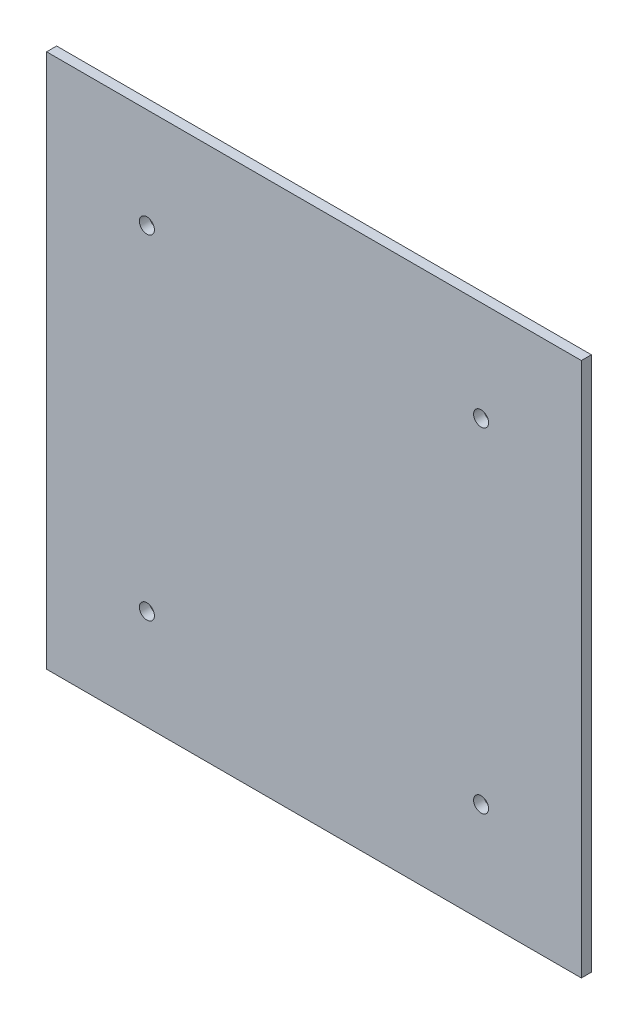
ISO-10303-21;
HEADER;
FILE_DESCRIPTION(('STEP AP214'),'2;1');
FILE_NAME('part.step','',(''),(''),'','','');
FILE_SCHEMA(('AUTOMOTIVE_DESIGN { 1 0 10303 214 1 1 1 1 }'));
ENDSEC;
DATA;
#1=APPLICATION_CONTEXT('core data for automotive mechanical design processes');
#2=APPLICATION_PROTOCOL_DEFINITION('international standard','automotive_design',2000,#1);
#3=PRODUCT_CONTEXT('',#1,'mechanical');
#4=PRODUCT('Part','Part','',(#3));
#5=PRODUCT_RELATED_PRODUCT_CATEGORY('part','',(#4));
#6=PRODUCT_DEFINITION_FORMATION('','',#4);
#7=PRODUCT_DEFINITION_CONTEXT('part definition',#1,'design');
#8=PRODUCT_DEFINITION('design','',#6,#7);
#9=PRODUCT_DEFINITION_SHAPE('','',#8);
#10=(LENGTH_UNIT() NAMED_UNIT(*) SI_UNIT(.MILLI.,.METRE.));
#11=(NAMED_UNIT(*) PLANE_ANGLE_UNIT() SI_UNIT($,.RADIAN.));
#12=(NAMED_UNIT(*) SI_UNIT($,.STERADIAN.) SOLID_ANGLE_UNIT());
#13=UNCERTAINTY_MEASURE_WITH_UNIT(LENGTH_MEASURE(1.E-05),#10,'distance_accuracy_value','');
#14=(GEOMETRIC_REPRESENTATION_CONTEXT(3) GLOBAL_UNCERTAINTY_ASSIGNED_CONTEXT((#13)) GLOBAL_UNIT_ASSIGNED_CONTEXT((#10,
#11,#12)) REPRESENTATION_CONTEXT('',''));
#15=CARTESIAN_POINT('',(0.,0.,0.));
#16=DIRECTION('',(0.,0.,1.));
#17=DIRECTION('',(1.,0.,0.));
#18=AXIS2_PLACEMENT_3D('',#15,#16,#17);
#19=CARTESIAN_POINT('',(0.,0.,3.));
#20=DIRECTION('',(0.,0.,1.));
#21=DIRECTION('',(1.,0.,0.));
#22=AXIS2_PLACEMENT_3D('',#19,#20,#21);
#23=PLANE('',#22);
#24=CARTESIAN_POINT('',(50.,50.,3.));
#25=DIRECTION('',(0.,0.,1.));
#26=DIRECTION('',(1.,0.,0.));
#27=AXIS2_PLACEMENT_3D('',#24,#25,#26);
#28=CIRCLE('',#27,2.25);
#29=CARTESIAN_POINT('',(52.25,50.,3.));
#30=VERTEX_POINT('',#29);
#31=EDGE_CURVE('E120',#30,#30,#28,.T.);
#32=ORIENTED_EDGE('',*,*,#31,.F.);
#33=EDGE_LOOP('',(#32));
#34=FACE_BOUND('',#33,.T.);
#35=CARTESIAN_POINT('',(50.,-50.,3.));
#36=DIRECTION('',(0.,0.,1.));
#37=DIRECTION('',(1.,0.,0.));
#38=AXIS2_PLACEMENT_3D('',#35,#36,#37);
#39=CIRCLE('',#38,2.25);
#40=CARTESIAN_POINT('',(52.25,-50.,3.));
#41=VERTEX_POINT('',#40);
#42=EDGE_CURVE('E116',#41,#41,#39,.T.);
#43=ORIENTED_EDGE('',*,*,#42,.F.);
#44=EDGE_LOOP('',(#43));
#45=FACE_BOUND('',#44,.T.);
#46=CARTESIAN_POINT('',(-50.,50.,3.));
#47=DIRECTION('',(0.,0.,1.));
#48=DIRECTION('',(1.,0.,0.));
#49=AXIS2_PLACEMENT_3D('',#46,#47,#48);
#50=CIRCLE('',#49,2.25);
#51=CARTESIAN_POINT('',(-47.75,50.,3.));
#52=VERTEX_POINT('',#51);
#53=EDGE_CURVE('E112',#52,#52,#50,.T.);
#54=ORIENTED_EDGE('',*,*,#53,.F.);
#55=EDGE_LOOP('',(#54));
#56=FACE_BOUND('',#55,.T.);
#57=CARTESIAN_POINT('',(-50.,-50.,3.));
#58=DIRECTION('',(0.,0.,1.));
#59=DIRECTION('',(1.,0.,0.));
#60=AXIS2_PLACEMENT_3D('',#57,#58,#59);
#61=CIRCLE('',#60,2.25);
#62=CARTESIAN_POINT('',(-47.75,-50.,3.));
#63=VERTEX_POINT('',#62);
#64=EDGE_CURVE('E77',#63,#63,#61,.T.);
#65=ORIENTED_EDGE('',*,*,#64,.F.);
#66=EDGE_LOOP('',(#65));
#67=FACE_BOUND('',#66,.T.);
#68=DIRECTION('',(-1.,0.,0.));
#69=VECTOR('',#68,1.);
#70=CARTESIAN_POINT('',(0.,-80.,3.));
#71=LINE('',#70,#69);
#72=CARTESIAN_POINT('',(80.,-80.,3.));
#73=VERTEX_POINT('',#72);
#74=CARTESIAN_POINT('',(-80.,-80.,3.));
#75=VERTEX_POINT('',#74);
#76=EDGE_CURVE('E11',#73,#75,#71,.T.);
#77=ORIENTED_EDGE('',*,*,#76,.F.);
#78=DIRECTION('',(0.,-1.,0.));
#79=VECTOR('',#78,1.);
#80=CARTESIAN_POINT('',(80.,0.,3.));
#81=LINE('',#80,#79);
#82=CARTESIAN_POINT('',(80.,80.,3.));
#83=VERTEX_POINT('',#82);
#84=EDGE_CURVE('E64',#83,#73,#81,.T.);
#85=ORIENTED_EDGE('',*,*,#84,.F.);
#86=DIRECTION('',(1.,0.,0.));
#87=VECTOR('',#86,1.);
#88=CARTESIAN_POINT('',(0.,80.,3.));
#89=LINE('',#88,#87);
#90=CARTESIAN_POINT('',(-80.,80.,3.));
#91=VERTEX_POINT('',#90);
#92=EDGE_CURVE('E103',#91,#83,#89,.T.);
#93=ORIENTED_EDGE('',*,*,#92,.F.);
#94=DIRECTION('',(0.,1.,0.));
#95=VECTOR('',#94,1.);
#96=CARTESIAN_POINT('',(-80.,0.,3.));
#97=LINE('',#96,#95);
#98=EDGE_CURVE('E26',#75,#91,#97,.T.);
#99=ORIENTED_EDGE('',*,*,#98,.F.);
#100=EDGE_LOOP('',(#77,#85,#93,#99));
#101=FACE_BOUND('',#100,.T.);
#102=ADVANCED_FACE('F17',(#34,#45,#56,#67,#101),#23,.T.);
#103=CARTESIAN_POINT('',(0.,-80.,0.));
#104=DIRECTION('',(0.,-1.,0.));
#105=DIRECTION('',(0.,0.,-1.));
#106=AXIS2_PLACEMENT_3D('',#103,#104,#105);
#107=PLANE('',#106);
#108=DIRECTION('',(0.,0.,1.));
#109=VECTOR('',#108,1.);
#110=CARTESIAN_POINT('',(80.,-80.,0.));
#111=LINE('',#110,#109);
#112=CARTESIAN_POINT('',(80.,-80.,0.));
#113=VERTEX_POINT('',#112);
#114=EDGE_CURVE('E57',#113,#73,#111,.T.);
#115=ORIENTED_EDGE('',*,*,#114,.T.);
#116=ORIENTED_EDGE('',*,*,#76,.T.);
#117=DIRECTION('',(0.,0.,1.));
#118=VECTOR('',#117,1.);
#119=CARTESIAN_POINT('',(-80.,-80.,0.));
#120=LINE('',#119,#118);
#121=CARTESIAN_POINT('',(-80.,-80.,0.));
#122=VERTEX_POINT('',#121);
#123=EDGE_CURVE('E71',#122,#75,#120,.T.);
#124=ORIENTED_EDGE('',*,*,#123,.F.);
#125=DIRECTION('',(1.,0.,0.));
#126=VECTOR('',#125,1.);
#127=CARTESIAN_POINT('',(0.,-80.,0.));
#128=LINE('',#127,#126);
#129=EDGE_CURVE('E69',#122,#113,#128,.T.);
#130=ORIENTED_EDGE('',*,*,#129,.T.);
#131=EDGE_LOOP('',(#115,#116,#124,#130));
#132=FACE_BOUND('',#131,.T.);
#133=ADVANCED_FACE('F70',(#132),#107,.T.);
#134=CARTESIAN_POINT('',(-80.,0.,0.));
#135=DIRECTION('',(-1.,0.,0.));
#136=DIRECTION('',(0.,0.,1.));
#137=AXIS2_PLACEMENT_3D('',#134,#135,#136);
#138=PLANE('',#137);
#139=ORIENTED_EDGE('',*,*,#123,.T.);
#140=ORIENTED_EDGE('',*,*,#98,.T.);
#141=DIRECTION('',(0.,0.,1.));
#142=VECTOR('',#141,1.);
#143=CARTESIAN_POINT('',(-80.,80.,0.));
#144=LINE('',#143,#142);
#145=CARTESIAN_POINT('',(-80.,80.,0.));
#146=VERTEX_POINT('',#145);
#147=EDGE_CURVE('E95',#146,#91,#144,.T.);
#148=ORIENTED_EDGE('',*,*,#147,.F.);
#149=DIRECTION('',(0.,-1.,0.));
#150=VECTOR('',#149,1.);
#151=CARTESIAN_POINT('',(-80.,0.,0.));
#152=LINE('',#151,#150);
#153=EDGE_CURVE('E76',#146,#122,#152,.T.);
#154=ORIENTED_EDGE('',*,*,#153,.T.);
#155=EDGE_LOOP('',(#139,#140,#148,#154));
#156=FACE_BOUND('',#155,.T.);
#157=ADVANCED_FACE('F145',(#156),#138,.T.);
#158=CARTESIAN_POINT('',(0.,80.,0.));
#159=DIRECTION('',(0.,1.,0.));
#160=DIRECTION('',(0.,0.,1.));
#161=AXIS2_PLACEMENT_3D('',#158,#159,#160);
#162=PLANE('',#161);
#163=ORIENTED_EDGE('',*,*,#147,.T.);
#164=ORIENTED_EDGE('',*,*,#92,.T.);
#165=DIRECTION('',(0.,0.,1.));
#166=VECTOR('',#165,1.);
#167=CARTESIAN_POINT('',(80.,80.,0.));
#168=LINE('',#167,#166);
#169=CARTESIAN_POINT('',(80.,80.,0.));
#170=VERTEX_POINT('',#169);
#171=EDGE_CURVE('E66',#170,#83,#168,.T.);
#172=ORIENTED_EDGE('',*,*,#171,.F.);
#173=DIRECTION('',(-1.,0.,0.));
#174=VECTOR('',#173,1.);
#175=CARTESIAN_POINT('',(0.,80.,0.));
#176=LINE('',#175,#174);
#177=EDGE_CURVE('E82',#170,#146,#176,.T.);
#178=ORIENTED_EDGE('',*,*,#177,.T.);
#179=EDGE_LOOP('',(#163,#164,#172,#178));
#180=FACE_BOUND('',#179,.T.);
#181=ADVANCED_FACE('F147',(#180),#162,.T.);
#182=CARTESIAN_POINT('',(0.,0.,0.));
#183=DIRECTION('',(0.,0.,-1.));
#184=DIRECTION('',(-1.,0.,0.));
#185=AXIS2_PLACEMENT_3D('',#182,#183,#184);
#186=PLANE('',#185);
#187=CARTESIAN_POINT('',(50.,50.,0.));
#188=DIRECTION('',(0.,0.,-1.));
#189=DIRECTION('',(-1.,0.,0.));
#190=AXIS2_PLACEMENT_3D('',#187,#188,#189);
#191=CIRCLE('',#190,2.25);
#192=CARTESIAN_POINT('',(47.75,50.,0.));
#193=VERTEX_POINT('',#192);
#194=EDGE_CURVE('E20',#193,#193,#191,.T.);
#195=ORIENTED_EDGE('',*,*,#194,.F.);
#196=EDGE_LOOP('',(#195));
#197=FACE_BOUND('',#196,.T.);
#198=CARTESIAN_POINT('',(50.,-50.,0.));
#199=DIRECTION('',(0.,0.,-1.));
#200=DIRECTION('',(-1.,0.,0.));
#201=AXIS2_PLACEMENT_3D('',#198,#199,#200);
#202=CIRCLE('',#201,2.25);
#203=CARTESIAN_POINT('',(47.75,-50.,0.));
#204=VERTEX_POINT('',#203);
#205=EDGE_CURVE('E117',#204,#204,#202,.T.);
#206=ORIENTED_EDGE('',*,*,#205,.F.);
#207=EDGE_LOOP('',(#206));
#208=FACE_BOUND('',#207,.T.);
#209=CARTESIAN_POINT('',(-50.,50.,0.));
#210=DIRECTION('',(0.,0.,-1.));
#211=DIRECTION('',(-1.,0.,0.));
#212=AXIS2_PLACEMENT_3D('',#209,#210,#211);
#213=CIRCLE('',#212,2.25);
#214=CARTESIAN_POINT('',(-52.25,50.,0.));
#215=VERTEX_POINT('',#214);
#216=EDGE_CURVE('E113',#215,#215,#213,.T.);
#217=ORIENTED_EDGE('',*,*,#216,.F.);
#218=EDGE_LOOP('',(#217));
#219=FACE_BOUND('',#218,.T.);
#220=CARTESIAN_POINT('',(-50.,-50.,0.));
#221=DIRECTION('',(0.,0.,-1.));
#222=DIRECTION('',(-1.,0.,0.));
#223=AXIS2_PLACEMENT_3D('',#220,#221,#222);
#224=CIRCLE('',#223,2.25);
#225=CARTESIAN_POINT('',(-52.25,-50.,0.));
#226=VERTEX_POINT('',#225);
#227=EDGE_CURVE('E108',#226,#226,#224,.T.);
#228=ORIENTED_EDGE('',*,*,#227,.F.);
#229=EDGE_LOOP('',(#228));
#230=FACE_BOUND('',#229,.T.);
#231=DIRECTION('',(0.,1.,0.));
#232=VECTOR('',#231,1.);
#233=CARTESIAN_POINT('',(80.,0.,0.));
#234=LINE('',#233,#232);
#235=EDGE_CURVE('E62',#113,#170,#234,.T.);
#236=ORIENTED_EDGE('',*,*,#235,.F.);
#237=ORIENTED_EDGE('',*,*,#129,.F.);
#238=ORIENTED_EDGE('',*,*,#153,.F.);
#239=ORIENTED_EDGE('',*,*,#177,.F.);
#240=EDGE_LOOP('',(#236,#237,#238,#239));
#241=FACE_BOUND('',#240,.T.);
#242=ADVANCED_FACE('F80',(#197,#208,#219,#230,#241),#186,.T.);
#243=CARTESIAN_POINT('',(80.,0.,0.));
#244=DIRECTION('',(1.,0.,0.));
#245=DIRECTION('',(0.,0.,-1.));
#246=AXIS2_PLACEMENT_3D('',#243,#244,#245);
#247=PLANE('',#246);
#248=ORIENTED_EDGE('',*,*,#235,.T.);
#249=ORIENTED_EDGE('',*,*,#171,.T.);
#250=ORIENTED_EDGE('',*,*,#84,.T.);
#251=ORIENTED_EDGE('',*,*,#114,.F.);
#252=EDGE_LOOP('',(#248,#249,#250,#251));
#253=FACE_BOUND('',#252,.T.);
#254=ADVANCED_FACE('F59',(#253),#247,.T.);
#255=CARTESIAN_POINT('',(-50.,-50.,-0.3));
#256=DIRECTION('',(0.,0.,1.));
#257=DIRECTION('',(1.,0.,0.));
#258=AXIS2_PLACEMENT_3D('',#255,#256,#257);
#259=CYLINDRICAL_SURFACE('',#258,2.25);
#260=ORIENTED_EDGE('',*,*,#64,.T.);
#261=EDGE_LOOP('',(#260));
#262=FACE_BOUND('',#261,.T.);
#263=ORIENTED_EDGE('',*,*,#227,.T.);
#264=EDGE_LOOP('',(#263));
#265=FACE_BOUND('',#264,.T.);
#266=ADVANCED_FACE('F139',(#262,#265),#259,.F.);
#267=CARTESIAN_POINT('',(-50.,50.,-0.3));
#268=DIRECTION('',(0.,0.,1.));
#269=DIRECTION('',(1.,0.,0.));
#270=AXIS2_PLACEMENT_3D('',#267,#268,#269);
#271=CYLINDRICAL_SURFACE('',#270,2.25);
#272=ORIENTED_EDGE('',*,*,#53,.T.);
#273=EDGE_LOOP('',(#272));
#274=FACE_BOUND('',#273,.T.);
#275=ORIENTED_EDGE('',*,*,#216,.T.);
#276=EDGE_LOOP('',(#275));
#277=FACE_BOUND('',#276,.T.);
#278=ADVANCED_FACE('F198',(#274,#277),#271,.F.);
#279=CARTESIAN_POINT('',(50.,-50.,-0.3));
#280=DIRECTION('',(0.,0.,1.));
#281=DIRECTION('',(1.,0.,0.));
#282=AXIS2_PLACEMENT_3D('',#279,#280,#281);
#283=CYLINDRICAL_SURFACE('',#282,2.25);
#284=ORIENTED_EDGE('',*,*,#42,.T.);
#285=EDGE_LOOP('',(#284));
#286=FACE_BOUND('',#285,.T.);
#287=ORIENTED_EDGE('',*,*,#205,.T.);
#288=EDGE_LOOP('',(#287));
#289=FACE_BOUND('',#288,.T.);
#290=ADVANCED_FACE('F207',(#286,#289),#283,.F.);
#291=CARTESIAN_POINT('',(50.,50.,-0.3));
#292=DIRECTION('',(0.,0.,1.));
#293=DIRECTION('',(1.,0.,0.));
#294=AXIS2_PLACEMENT_3D('',#291,#292,#293);
#295=CYLINDRICAL_SURFACE('',#294,2.25);
#296=ORIENTED_EDGE('',*,*,#31,.T.);
#297=EDGE_LOOP('',(#296));
#298=FACE_BOUND('',#297,.T.);
#299=ORIENTED_EDGE('',*,*,#194,.T.);
#300=EDGE_LOOP('',(#299));
#301=FACE_BOUND('',#300,.T.);
#302=ADVANCED_FACE('F217',(#298,#301),#295,.F.);
#303=CLOSED_SHELL('',(#102,#133,#157,#181,#242,#254,#266,#278,#290,#302));
#304=MANIFOLD_SOLID_BREP('B1',#303);
#305=ADVANCED_BREP_SHAPE_REPRESENTATION('',(#18,#304),#14);
#306=SHAPE_DEFINITION_REPRESENTATION(#9,#305);
ENDSEC;
END-ISO-10303-21;
